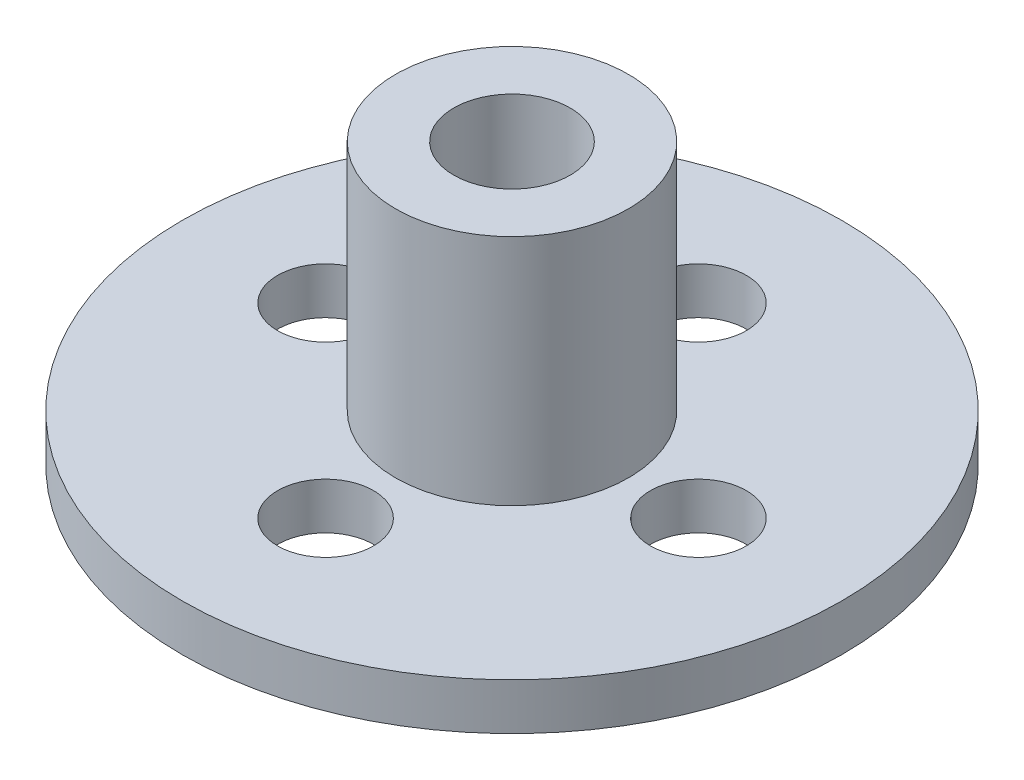
ISO-10303-21;
HEADER;
FILE_DESCRIPTION(('STEP AP214'),'2;1');
FILE_NAME('part.step','',(''),(''),'','','');
FILE_SCHEMA(('AUTOMOTIVE_DESIGN { 1 0 10303 214 1 1 1 1 }'));
ENDSEC;
DATA;
#1=APPLICATION_CONTEXT('core data for automotive mechanical design processes');
#2=APPLICATION_PROTOCOL_DEFINITION('international standard','automotive_design',2000,#1);
#3=PRODUCT_CONTEXT('',#1,'mechanical');
#4=PRODUCT('Part','Part','',(#3));
#5=PRODUCT_RELATED_PRODUCT_CATEGORY('part','',(#4));
#6=PRODUCT_DEFINITION_FORMATION('','',#4);
#7=PRODUCT_DEFINITION_CONTEXT('part definition',#1,'design');
#8=PRODUCT_DEFINITION('design','',#6,#7);
#9=PRODUCT_DEFINITION_SHAPE('','',#8);
#10=(LENGTH_UNIT() NAMED_UNIT(*) SI_UNIT(.MILLI.,.METRE.));
#11=(NAMED_UNIT(*) PLANE_ANGLE_UNIT() SI_UNIT($,.RADIAN.));
#12=(NAMED_UNIT(*) SI_UNIT($,.STERADIAN.) SOLID_ANGLE_UNIT());
#13=UNCERTAINTY_MEASURE_WITH_UNIT(LENGTH_MEASURE(1.E-05),#10,'distance_accuracy_value','');
#14=(GEOMETRIC_REPRESENTATION_CONTEXT(3) GLOBAL_UNCERTAINTY_ASSIGNED_CONTEXT((#13)) GLOBAL_UNIT_ASSIGNED_CONTEXT((#10,
#11,#12)) REPRESENTATION_CONTEXT('',''));
#15=CARTESIAN_POINT('',(0.,0.,0.));
#16=DIRECTION('',(0.,0.,1.));
#17=DIRECTION('',(1.,0.,0.));
#18=AXIS2_PLACEMENT_3D('',#15,#16,#17);
#19=CARTESIAN_POINT('',(0.,2.,0.));
#20=DIRECTION('',(0.,1.,0.));
#21=DIRECTION('',(0.,0.,1.));
#22=AXIS2_PLACEMENT_3D('',#19,#20,#21);
#23=PLANE('',#22);
#24=CARTESIAN_POINT('',(0.,2.,0.));
#25=DIRECTION('',(0.,1.,0.));
#26=DIRECTION('',(0.,0.,1.));
#27=AXIS2_PLACEMENT_3D('',#24,#25,#26);
#28=CIRCLE('',#27,5.);
#29=CARTESIAN_POINT('',(0.,2.,5.));
#30=VERTEX_POINT('',#29);
#31=EDGE_CURVE('E81',#30,#30,#28,.T.);
#32=ORIENTED_EDGE('',*,*,#31,.F.);
#33=EDGE_LOOP('',(#32));
#34=FACE_BOUND('',#33,.T.);
#35=CARTESIAN_POINT('',(0.,2.,8.));
#36=DIRECTION('',(0.,1.,0.));
#37=DIRECTION('',(0.,0.,1.));
#38=AXIS2_PLACEMENT_3D('',#35,#36,#37);
#39=CIRCLE('',#38,2.05808124196885);
#40=CARTESIAN_POINT('',(0.,2.,10.0580812419688));
#41=VERTEX_POINT('',#40);
#42=EDGE_CURVE('E66',#41,#41,#39,.T.);
#43=ORIENTED_EDGE('',*,*,#42,.F.);
#44=EDGE_LOOP('',(#43));
#45=FACE_BOUND('',#44,.T.);
#46=CARTESIAN_POINT('',(0.,2.,-8.));
#47=DIRECTION('',(0.,1.,0.));
#48=DIRECTION('',(0.,0.,1.));
#49=AXIS2_PLACEMENT_3D('',#46,#47,#48);
#50=CIRCLE('',#49,2.05808124196885);
#51=CARTESIAN_POINT('',(0.,2.,-5.94191875803115));
#52=VERTEX_POINT('',#51);
#53=EDGE_CURVE('E55',#52,#52,#50,.T.);
#54=ORIENTED_EDGE('',*,*,#53,.F.);
#55=EDGE_LOOP('',(#54));
#56=FACE_BOUND('',#55,.T.);
#57=CARTESIAN_POINT('',(0.,2.,0.));
#58=DIRECTION('',(0.,1.,0.));
#59=DIRECTION('',(0.,0.,1.));
#60=AXIS2_PLACEMENT_3D('',#57,#58,#59);
#61=CIRCLE('',#60,14.1493085385358);
#62=CARTESIAN_POINT('',(0.,2.,14.1493085385358));
#63=VERTEX_POINT('',#62);
#64=EDGE_CURVE('E46',#63,#63,#61,.T.);
#65=ORIENTED_EDGE('',*,*,#64,.T.);
#66=EDGE_LOOP('',(#65));
#67=FACE_BOUND('',#66,.T.);
#68=CARTESIAN_POINT('',(-8.,2.,0.));
#69=DIRECTION('',(0.,1.,0.));
#70=DIRECTION('',(0.,0.,1.));
#71=AXIS2_PLACEMENT_3D('',#68,#69,#70);
#72=CIRCLE('',#71,2.05808124196885);
#73=CARTESIAN_POINT('',(-8.,2.,2.05808124196885));
#74=VERTEX_POINT('',#73);
#75=EDGE_CURVE('E60',#74,#74,#72,.T.);
#76=ORIENTED_EDGE('',*,*,#75,.F.);
#77=EDGE_LOOP('',(#76));
#78=FACE_BOUND('',#77,.T.);
#79=CARTESIAN_POINT('',(8.,2.,0.));
#80=DIRECTION('',(0.,1.,0.));
#81=DIRECTION('',(0.,0.,1.));
#82=AXIS2_PLACEMENT_3D('',#79,#80,#81);
#83=CIRCLE('',#82,2.05808124196885);
#84=CARTESIAN_POINT('',(8.,2.,2.05808124196885));
#85=VERTEX_POINT('',#84);
#86=EDGE_CURVE('E72',#85,#85,#83,.T.);
#87=ORIENTED_EDGE('',*,*,#86,.F.);
#88=EDGE_LOOP('',(#87));
#89=FACE_BOUND('',#88,.T.);
#90=ADVANCED_FACE('F39',(#34,#45,#56,#67,#78,#89),#23,.T.);
#91=CARTESIAN_POINT('',(0.,0.,0.));
#92=DIRECTION('',(0.,1.,0.));
#93=DIRECTION('',(0.,0.,1.));
#94=AXIS2_PLACEMENT_3D('',#91,#92,#93);
#95=PLANE('',#94);
#96=CARTESIAN_POINT('',(0.,0.,0.));
#97=DIRECTION('',(0.,1.,0.));
#98=DIRECTION('',(0.,0.,1.));
#99=AXIS2_PLACEMENT_3D('',#96,#97,#98);
#100=CIRCLE('',#99,14.1493085385358);
#101=CARTESIAN_POINT('',(0.,0.,14.1493085385358));
#102=VERTEX_POINT('',#101);
#103=EDGE_CURVE('E50',#102,#102,#100,.T.);
#104=ORIENTED_EDGE('',*,*,#103,.F.);
#105=EDGE_LOOP('',(#104));
#106=FACE_BOUND('',#105,.T.);
#107=CARTESIAN_POINT('',(0.,0.,-8.));
#108=DIRECTION('',(0.,1.,0.));
#109=DIRECTION('',(0.,0.,1.));
#110=AXIS2_PLACEMENT_3D('',#107,#108,#109);
#111=CIRCLE('',#110,2.05808124196885);
#112=CARTESIAN_POINT('',(0.,0.,-5.94191875803115));
#113=VERTEX_POINT('',#112);
#114=EDGE_CURVE('E57',#113,#113,#111,.T.);
#115=ORIENTED_EDGE('',*,*,#114,.T.);
#116=EDGE_LOOP('',(#115));
#117=FACE_BOUND('',#116,.T.);
#118=CARTESIAN_POINT('',(-8.,0.,0.));
#119=DIRECTION('',(0.,1.,0.));
#120=DIRECTION('',(0.,0.,1.));
#121=AXIS2_PLACEMENT_3D('',#118,#119,#120);
#122=CIRCLE('',#121,2.05808124196885);
#123=CARTESIAN_POINT('',(-8.,0.,2.05808124196885));
#124=VERTEX_POINT('',#123);
#125=EDGE_CURVE('E63',#124,#124,#122,.T.);
#126=ORIENTED_EDGE('',*,*,#125,.T.);
#127=EDGE_LOOP('',(#126));
#128=FACE_BOUND('',#127,.T.);
#129=CARTESIAN_POINT('',(0.,0.,8.));
#130=DIRECTION('',(0.,1.,0.));
#131=DIRECTION('',(0.,0.,1.));
#132=AXIS2_PLACEMENT_3D('',#129,#130,#131);
#133=CIRCLE('',#132,2.05808124196885);
#134=CARTESIAN_POINT('',(0.,0.,10.0580812419688));
#135=VERTEX_POINT('',#134);
#136=EDGE_CURVE('E69',#135,#135,#133,.T.);
#137=ORIENTED_EDGE('',*,*,#136,.T.);
#138=EDGE_LOOP('',(#137));
#139=FACE_BOUND('',#138,.T.);
#140=CARTESIAN_POINT('',(8.,0.,0.));
#141=DIRECTION('',(0.,1.,0.));
#142=DIRECTION('',(0.,0.,1.));
#143=AXIS2_PLACEMENT_3D('',#140,#141,#142);
#144=CIRCLE('',#143,2.05808124196885);
#145=CARTESIAN_POINT('',(8.,0.,2.05808124196885));
#146=VERTEX_POINT('',#145);
#147=EDGE_CURVE('E75',#146,#146,#144,.T.);
#148=ORIENTED_EDGE('',*,*,#147,.T.);
#149=EDGE_LOOP('',(#148));
#150=FACE_BOUND('',#149,.T.);
#151=ADVANCED_FACE('F109',(#106,#117,#128,#139,#150),#95,.F.);
#152=CARTESIAN_POINT('',(0.,2.,0.));
#153=DIRECTION('',(0.,-1.,0.));
#154=DIRECTION('',(0.,0.,-1.));
#155=AXIS2_PLACEMENT_3D('',#152,#153,#154);
#156=CYLINDRICAL_SURFACE('',#155,14.1493085385358);
#157=ORIENTED_EDGE('',*,*,#64,.F.);
#158=EDGE_LOOP('',(#157));
#159=FACE_BOUND('',#158,.T.);
#160=ORIENTED_EDGE('',*,*,#103,.T.);
#161=EDGE_LOOP('',(#160));
#162=FACE_BOUND('',#161,.T.);
#163=ADVANCED_FACE('F41',(#159,#162),#156,.T.);
#164=CARTESIAN_POINT('',(0.,2.,-8.));
#165=DIRECTION('',(0.,-1.,0.));
#166=DIRECTION('',(0.,0.,-1.));
#167=AXIS2_PLACEMENT_3D('',#164,#165,#166);
#168=CYLINDRICAL_SURFACE('',#167,2.05808124196885);
#169=ORIENTED_EDGE('',*,*,#53,.T.);
#170=EDGE_LOOP('',(#169));
#171=FACE_BOUND('',#170,.T.);
#172=ORIENTED_EDGE('',*,*,#114,.F.);
#173=EDGE_LOOP('',(#172));
#174=FACE_BOUND('',#173,.T.);
#175=ADVANCED_FACE('F166',(#171,#174),#168,.F.);
#176=CARTESIAN_POINT('',(-8.,2.,0.));
#177=DIRECTION('',(0.,-1.,0.));
#178=DIRECTION('',(0.,0.,-1.));
#179=AXIS2_PLACEMENT_3D('',#176,#177,#178);
#180=CYLINDRICAL_SURFACE('',#179,2.05808124196885);
#181=ORIENTED_EDGE('',*,*,#75,.T.);
#182=EDGE_LOOP('',(#181));
#183=FACE_BOUND('',#182,.T.);
#184=ORIENTED_EDGE('',*,*,#125,.F.);
#185=EDGE_LOOP('',(#184));
#186=FACE_BOUND('',#185,.T.);
#187=ADVANCED_FACE('F156',(#183,#186),#180,.F.);
#188=CARTESIAN_POINT('',(0.,2.,8.));
#189=DIRECTION('',(0.,-1.,0.));
#190=DIRECTION('',(0.,0.,-1.));
#191=AXIS2_PLACEMENT_3D('',#188,#189,#190);
#192=CYLINDRICAL_SURFACE('',#191,2.05808124196885);
#193=ORIENTED_EDGE('',*,*,#42,.T.);
#194=EDGE_LOOP('',(#193));
#195=FACE_BOUND('',#194,.T.);
#196=ORIENTED_EDGE('',*,*,#136,.F.);
#197=EDGE_LOOP('',(#196));
#198=FACE_BOUND('',#197,.T.);
#199=ADVANCED_FACE('F105',(#195,#198),#192,.F.);
#200=CARTESIAN_POINT('',(8.,2.,0.));
#201=DIRECTION('',(0.,-1.,0.));
#202=DIRECTION('',(0.,0.,-1.));
#203=AXIS2_PLACEMENT_3D('',#200,#201,#202);
#204=CYLINDRICAL_SURFACE('',#203,2.05808124196885);
#205=ORIENTED_EDGE('',*,*,#86,.T.);
#206=EDGE_LOOP('',(#205));
#207=FACE_BOUND('',#206,.T.);
#208=ORIENTED_EDGE('',*,*,#147,.F.);
#209=EDGE_LOOP('',(#208));
#210=FACE_BOUND('',#209,.T.);
#211=ADVANCED_FACE('F95',(#207,#210),#204,.F.);
#212=CARTESIAN_POINT('',(0.,12.,0.));
#213=DIRECTION('',(0.,1.,0.));
#214=DIRECTION('',(0.,0.,1.));
#215=AXIS2_PLACEMENT_3D('',#212,#213,#214);
#216=PLANE('',#215);
#217=CARTESIAN_POINT('',(0.,12.,0.));
#218=DIRECTION('',(0.,1.,0.));
#219=DIRECTION('',(0.,0.,1.));
#220=AXIS2_PLACEMENT_3D('',#217,#218,#219);
#221=CIRCLE('',#220,5.);
#222=CARTESIAN_POINT('',(0.,12.,5.));
#223=VERTEX_POINT('',#222);
#224=EDGE_CURVE('E78',#223,#223,#221,.T.);
#225=ORIENTED_EDGE('',*,*,#224,.T.);
#226=EDGE_LOOP('',(#225));
#227=FACE_BOUND('',#226,.T.);
#228=CARTESIAN_POINT('',(0.,12.,0.));
#229=DIRECTION('',(0.,1.,0.));
#230=DIRECTION('',(0.,0.,1.));
#231=AXIS2_PLACEMENT_3D('',#228,#229,#230);
#232=CIRCLE('',#231,2.5);
#233=CARTESIAN_POINT('',(0.,12.,2.5));
#234=VERTEX_POINT('',#233);
#235=EDGE_CURVE('E84',#234,#234,#232,.T.);
#236=ORIENTED_EDGE('',*,*,#235,.F.);
#237=EDGE_LOOP('',(#236));
#238=FACE_BOUND('',#237,.T.);
#239=ADVANCED_FACE('F92',(#227,#238),#216,.T.);
#240=CARTESIAN_POINT('',(0.,12.,0.));
#241=DIRECTION('',(0.,-1.,0.));
#242=DIRECTION('',(0.,0.,-1.));
#243=AXIS2_PLACEMENT_3D('',#240,#241,#242);
#244=CYLINDRICAL_SURFACE('',#243,5.);
#245=ORIENTED_EDGE('',*,*,#224,.F.);
#246=EDGE_LOOP('',(#245));
#247=FACE_BOUND('',#246,.T.);
#248=ORIENTED_EDGE('',*,*,#31,.T.);
#249=EDGE_LOOP('',(#248));
#250=FACE_BOUND('',#249,.T.);
#251=ADVANCED_FACE('F94',(#247,#250),#244,.T.);
#252=CARTESIAN_POINT('',(0.,12.,0.));
#253=DIRECTION('',(0.,-1.,0.));
#254=DIRECTION('',(0.,0.,-1.));
#255=AXIS2_PLACEMENT_3D('',#252,#253,#254);
#256=CYLINDRICAL_SURFACE('',#255,2.5);
#257=ORIENTED_EDGE('',*,*,#235,.T.);
#258=EDGE_LOOP('',(#257));
#259=FACE_BOUND('',#258,.T.);
#260=CARTESIAN_POINT('',(0.,2.,0.));
#261=DIRECTION('',(0.,1.,0.));
#262=DIRECTION('',(0.,0.,1.));
#263=AXIS2_PLACEMENT_3D('',#260,#261,#262);
#264=CIRCLE('',#263,2.5);
#265=CARTESIAN_POINT('',(0.,2.,2.5));
#266=VERTEX_POINT('',#265);
#267=EDGE_CURVE('E10',#266,#266,#264,.F.);
#268=ORIENTED_EDGE('',*,*,#267,.T.);
#269=EDGE_LOOP('',(#268));
#270=FACE_BOUND('',#269,.T.);
#271=ADVANCED_FACE('F90',(#259,#270),#256,.F.);
#272=ORIENTED_EDGE('',*,*,#267,.F.);
#273=EDGE_LOOP('',(#272));
#274=FACE_BOUND('',#273,.T.);
#275=ADVANCED_FACE('F112',(#274),#23,.T.);
#276=CLOSED_SHELL('',(#90,#151,#163,#175,#187,#199,#211,#239,#251,#271,#275));
#277=MANIFOLD_SOLID_BREP('B2',#276);
#278=ADVANCED_BREP_SHAPE_REPRESENTATION('',(#18,#277),#14);
#279=SHAPE_DEFINITION_REPRESENTATION(#9,#278);
ENDSEC;
END-ISO-10303-21;
